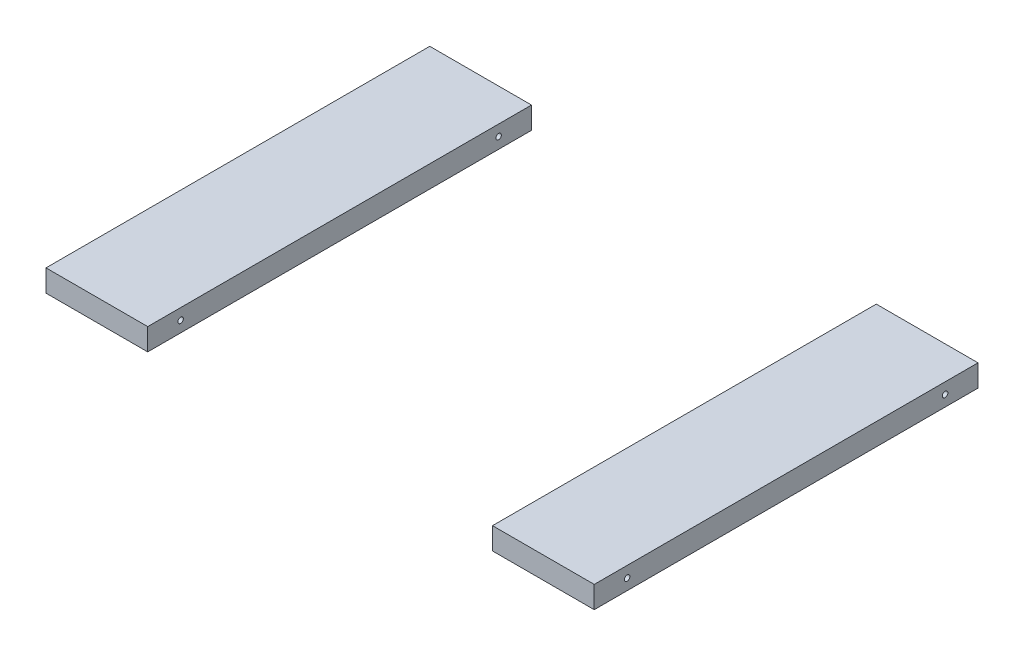
ISO-10303-21;
HEADER;
FILE_DESCRIPTION(('STEP AP214'),'2;1');
FILE_NAME('part.step','',(''),(''),'','','');
FILE_SCHEMA(('AUTOMOTIVE_DESIGN { 1 0 10303 214 1 1 1 1 }'));
ENDSEC;
DATA;
#1=APPLICATION_CONTEXT('core data for automotive mechanical design processes');
#2=APPLICATION_PROTOCOL_DEFINITION('international standard','automotive_design',2000,#1);
#3=PRODUCT_CONTEXT('',#1,'mechanical');
#4=PRODUCT('Part','Part','',(#3));
#5=PRODUCT_RELATED_PRODUCT_CATEGORY('part','',(#4));
#6=PRODUCT_DEFINITION_FORMATION('','',#4);
#7=PRODUCT_DEFINITION_CONTEXT('part definition',#1,'design');
#8=PRODUCT_DEFINITION('design','',#6,#7);
#9=PRODUCT_DEFINITION_SHAPE('','',#8);
#10=(LENGTH_UNIT() NAMED_UNIT(*) SI_UNIT(.MILLI.,.METRE.));
#11=(NAMED_UNIT(*) PLANE_ANGLE_UNIT() SI_UNIT($,.RADIAN.));
#12=(NAMED_UNIT(*) SI_UNIT($,.STERADIAN.) SOLID_ANGLE_UNIT());
#13=UNCERTAINTY_MEASURE_WITH_UNIT(LENGTH_MEASURE(1.E-05),#10,'distance_accuracy_value','');
#14=(GEOMETRIC_REPRESENTATION_CONTEXT(3) GLOBAL_UNCERTAINTY_ASSIGNED_CONTEXT((#13)) GLOBAL_UNIT_ASSIGNED_CONTEXT((#10,
#11,#12)) REPRESENTATION_CONTEXT('',''));
#15=CARTESIAN_POINT('',(0.,0.,0.));
#16=DIRECTION('',(0.,0.,1.));
#17=DIRECTION('',(1.,0.,0.));
#18=AXIS2_PLACEMENT_3D('',#15,#16,#17);
#19=CARTESIAN_POINT('',(-250.,20.,-175.));
#20=DIRECTION('',(0.,0.,1.));
#21=DIRECTION('',(1.,0.,0.));
#22=AXIS2_PLACEMENT_3D('',#19,#20,#21);
#23=PLANE('',#22);
#24=DIRECTION('',(-1.,0.,0.));
#25=VECTOR('',#24,1.);
#26=CARTESIAN_POINT('',(-250.,0.,-175.));
#27=LINE('',#26,#25);
#28=CARTESIAN_POINT('',(250.,0.,-175.));
#29=VERTEX_POINT('',#28);
#30=CARTESIAN_POINT('',(157.224048573218,0.,-175.));
#31=VERTEX_POINT('',#30);
#32=EDGE_CURVE('E76',#29,#31,#27,.T.);
#33=ORIENTED_EDGE('',*,*,#32,.T.);
#34=DIRECTION('',(0.,1.,0.));
#35=VECTOR('',#34,1.);
#36=CARTESIAN_POINT('',(157.224048573218,0.,-175.));
#37=LINE('',#36,#35);
#38=CARTESIAN_POINT('',(157.224048573218,20.,-175.));
#39=VERTEX_POINT('',#38);
#40=EDGE_CURVE('E95',#31,#39,#37,.T.);
#41=ORIENTED_EDGE('',*,*,#40,.T.);
#42=DIRECTION('',(-1.,0.,0.));
#43=VECTOR('',#42,1.);
#44=CARTESIAN_POINT('',(-250.,20.,-175.));
#45=LINE('',#44,#43);
#46=CARTESIAN_POINT('',(250.,20.,-175.));
#47=VERTEX_POINT('',#46);
#48=EDGE_CURVE('E90',#47,#39,#45,.T.);
#49=ORIENTED_EDGE('',*,*,#48,.F.);
#50=DIRECTION('',(0.,-1.,0.));
#51=VECTOR('',#50,1.);
#52=CARTESIAN_POINT('',(250.,20.,-175.));
#53=LINE('',#52,#51);
#54=EDGE_CURVE('E93',#47,#29,#53,.T.);
#55=ORIENTED_EDGE('',*,*,#54,.T.);
#56=EDGE_LOOP('',(#33,#41,#49,#55));
#57=FACE_BOUND('',#56,.T.);
#58=ADVANCED_FACE('F43',(#57),#23,.F.);
#59=CARTESIAN_POINT('',(-250.,20.,175.));
#60=DIRECTION('',(0.,0.,-1.));
#61=DIRECTION('',(-1.,0.,0.));
#62=AXIS2_PLACEMENT_3D('',#59,#60,#61);
#63=PLANE('',#62);
#64=DIRECTION('',(1.,0.,0.));
#65=VECTOR('',#64,1.);
#66=CARTESIAN_POINT('',(-250.,20.,175.));
#67=LINE('',#66,#65);
#68=CARTESIAN_POINT('',(157.224048573218,20.,175.));
#69=VERTEX_POINT('',#68);
#70=CARTESIAN_POINT('',(250.,20.,175.));
#71=VERTEX_POINT('',#70);
#72=EDGE_CURVE('E103',#69,#71,#67,.T.);
#73=ORIENTED_EDGE('',*,*,#72,.F.);
#74=DIRECTION('',(0.,1.,0.));
#75=VECTOR('',#74,1.);
#76=CARTESIAN_POINT('',(157.224048573218,0.,175.));
#77=LINE('',#76,#75);
#78=CARTESIAN_POINT('',(157.224048573218,0.,175.));
#79=VERTEX_POINT('',#78);
#80=EDGE_CURVE('E12',#79,#69,#77,.T.);
#81=ORIENTED_EDGE('',*,*,#80,.F.);
#82=DIRECTION('',(1.,0.,0.));
#83=VECTOR('',#82,1.);
#84=CARTESIAN_POINT('',(-250.,0.,175.));
#85=LINE('',#84,#83);
#86=CARTESIAN_POINT('',(250.,0.,175.));
#87=VERTEX_POINT('',#86);
#88=EDGE_CURVE('E85',#79,#87,#85,.T.);
#89=ORIENTED_EDGE('',*,*,#88,.T.);
#90=DIRECTION('',(0.,-1.,0.));
#91=VECTOR('',#90,1.);
#92=CARTESIAN_POINT('',(250.,20.,175.));
#93=LINE('',#92,#91);
#94=EDGE_CURVE('E115',#71,#87,#93,.T.);
#95=ORIENTED_EDGE('',*,*,#94,.F.);
#96=EDGE_LOOP('',(#73,#81,#89,#95));
#97=FACE_BOUND('',#96,.T.);
#98=ADVANCED_FACE('F151',(#97),#63,.F.);
#99=CARTESIAN_POINT('',(0.,20.,0.));
#100=DIRECTION('',(0.,1.,0.));
#101=DIRECTION('',(0.,0.,1.));
#102=AXIS2_PLACEMENT_3D('',#99,#100,#101);
#103=PLANE('',#102);
#104=DIRECTION('',(0.,0.,-1.));
#105=VECTOR('',#104,1.);
#106=CARTESIAN_POINT('',(157.224048573218,20.,-175.));
#107=LINE('',#106,#105);
#108=EDGE_CURVE('E52',#69,#39,#107,.T.);
#109=ORIENTED_EDGE('',*,*,#108,.F.);
#110=ORIENTED_EDGE('',*,*,#72,.T.);
#111=DIRECTION('',(0.,0.,-1.));
#112=VECTOR('',#111,1.);
#113=CARTESIAN_POINT('',(250.,20.,-175.));
#114=LINE('',#113,#112);
#115=EDGE_CURVE('E98',#71,#47,#114,.T.);
#116=ORIENTED_EDGE('',*,*,#115,.T.);
#117=ORIENTED_EDGE('',*,*,#48,.T.);
#118=EDGE_LOOP('',(#109,#110,#116,#117));
#119=FACE_BOUND('',#118,.T.);
#120=ADVANCED_FACE('F101',(#119),#103,.T.);
#121=CARTESIAN_POINT('',(0.,0.,0.));
#122=DIRECTION('',(0.,1.,0.));
#123=DIRECTION('',(0.,0.,1.));
#124=AXIS2_PLACEMENT_3D('',#121,#122,#123);
#125=PLANE('',#124);
#126=ORIENTED_EDGE('',*,*,#88,.F.);
#127=DIRECTION('',(0.,0.,-1.));
#128=VECTOR('',#127,1.);
#129=CARTESIAN_POINT('',(157.224048573218,0.,-175.));
#130=LINE('',#129,#128);
#131=EDGE_CURVE('E97',#79,#31,#130,.T.);
#132=ORIENTED_EDGE('',*,*,#131,.T.);
#133=ORIENTED_EDGE('',*,*,#32,.F.);
#134=DIRECTION('',(0.,0.,-1.));
#135=VECTOR('',#134,1.);
#136=CARTESIAN_POINT('',(250.,0.,-175.));
#137=LINE('',#136,#135);
#138=EDGE_CURVE('E107',#87,#29,#137,.T.);
#139=ORIENTED_EDGE('',*,*,#138,.F.);
#140=EDGE_LOOP('',(#126,#132,#133,#139));
#141=FACE_BOUND('',#140,.T.);
#142=ADVANCED_FACE('F138',(#141),#125,.F.);
#143=CARTESIAN_POINT('',(250.,20.,-175.));
#144=DIRECTION('',(-1.,0.,0.));
#145=DIRECTION('',(0.,0.,1.));
#146=AXIS2_PLACEMENT_3D('',#143,#144,#145);
#147=PLANE('',#146);
#148=CARTESIAN_POINT('',(250.,10.,145.));
#149=DIRECTION('',(1.,0.,0.));
#150=DIRECTION('',(0.,0.,-1.));
#151=AXIS2_PLACEMENT_3D('',#148,#149,#150);
#152=CIRCLE('',#151,2.5);
#153=CARTESIAN_POINT('',(250.,10.,142.5));
#154=VERTEX_POINT('',#153);
#155=EDGE_CURVE('E123',#154,#154,#152,.T.);
#156=ORIENTED_EDGE('',*,*,#155,.F.);
#157=EDGE_LOOP('',(#156));
#158=FACE_BOUND('',#157,.T.);
#159=CARTESIAN_POINT('',(250.,10.,-145.));
#160=DIRECTION('',(1.,0.,0.));
#161=DIRECTION('',(0.,0.,-1.));
#162=AXIS2_PLACEMENT_3D('',#159,#160,#161);
#163=CIRCLE('',#162,2.5);
#164=CARTESIAN_POINT('',(250.,10.,-147.5));
#165=VERTEX_POINT('',#164);
#166=EDGE_CURVE('E113',#165,#165,#163,.T.);
#167=ORIENTED_EDGE('',*,*,#166,.F.);
#168=EDGE_LOOP('',(#167));
#169=FACE_BOUND('',#168,.T.);
#170=ORIENTED_EDGE('',*,*,#138,.T.);
#171=ORIENTED_EDGE('',*,*,#54,.F.);
#172=ORIENTED_EDGE('',*,*,#115,.F.);
#173=ORIENTED_EDGE('',*,*,#94,.T.);
#174=EDGE_LOOP('',(#170,#171,#172,#173));
#175=FACE_BOUND('',#174,.T.);
#176=ADVANCED_FACE('F106',(#158,#169,#175),#147,.F.);
#177=CARTESIAN_POINT('',(157.224048573218,0.,-175.));
#178=DIRECTION('',(1.,0.,0.));
#179=DIRECTION('',(0.,0.,-1.));
#180=AXIS2_PLACEMENT_3D('',#177,#178,#179);
#181=PLANE('',#180);
#182=CARTESIAN_POINT('',(157.224048573218,10.,145.));
#183=DIRECTION('',(1.,0.,0.));
#184=DIRECTION('',(0.,0.,-1.));
#185=AXIS2_PLACEMENT_3D('',#182,#183,#184);
#186=CIRCLE('',#185,2.5);
#187=CARTESIAN_POINT('',(157.224048573218,10.,142.5));
#188=VERTEX_POINT('',#187);
#189=EDGE_CURVE('E46',#188,#188,#186,.T.);
#190=ORIENTED_EDGE('',*,*,#189,.T.);
#191=EDGE_LOOP('',(#190));
#192=FACE_BOUND('',#191,.T.);
#193=CARTESIAN_POINT('',(157.224048573218,10.,-145.));
#194=DIRECTION('',(1.,0.,0.));
#195=DIRECTION('',(0.,0.,-1.));
#196=AXIS2_PLACEMENT_3D('',#193,#194,#195);
#197=CIRCLE('',#196,2.5);
#198=CARTESIAN_POINT('',(157.224048573218,10.,-147.5));
#199=VERTEX_POINT('',#198);
#200=EDGE_CURVE('E121',#199,#199,#197,.T.);
#201=ORIENTED_EDGE('',*,*,#200,.T.);
#202=EDGE_LOOP('',(#201));
#203=FACE_BOUND('',#202,.T.);
#204=ORIENTED_EDGE('',*,*,#108,.T.);
#205=ORIENTED_EDGE('',*,*,#40,.F.);
#206=ORIENTED_EDGE('',*,*,#131,.F.);
#207=ORIENTED_EDGE('',*,*,#80,.T.);
#208=EDGE_LOOP('',(#204,#205,#206,#207));
#209=FACE_BOUND('',#208,.T.);
#210=ADVANCED_FACE('F137',(#192,#203,#209),#181,.F.);
#211=CARTESIAN_POINT('',(-250.,10.,-145.));
#212=DIRECTION('',(1.,0.,0.));
#213=DIRECTION('',(0.,0.,-1.));
#214=AXIS2_PLACEMENT_3D('',#211,#212,#213);
#215=CYLINDRICAL_SURFACE('',#214,2.5);
#216=ORIENTED_EDGE('',*,*,#166,.T.);
#217=EDGE_LOOP('',(#216));
#218=FACE_BOUND('',#217,.T.);
#219=ORIENTED_EDGE('',*,*,#200,.F.);
#220=EDGE_LOOP('',(#219));
#221=FACE_BOUND('',#220,.T.);
#222=ADVANCED_FACE('F133',(#218,#221),#215,.F.);
#223=CARTESIAN_POINT('',(-250.,10.,145.));
#224=DIRECTION('',(1.,0.,0.));
#225=DIRECTION('',(0.,0.,-1.));
#226=AXIS2_PLACEMENT_3D('',#223,#224,#225);
#227=CYLINDRICAL_SURFACE('',#226,2.5);
#228=ORIENTED_EDGE('',*,*,#155,.T.);
#229=EDGE_LOOP('',(#228));
#230=FACE_BOUND('',#229,.T.);
#231=ORIENTED_EDGE('',*,*,#189,.F.);
#232=EDGE_LOOP('',(#231));
#233=FACE_BOUND('',#232,.T.);
#234=ADVANCED_FACE('F184',(#230,#233),#227,.F.);
#235=CLOSED_SHELL('',(#58,#98,#120,#142,#176,#210,#222,#234));
#236=MANIFOLD_SOLID_BREP('B2',#235);
#237=CARTESIAN_POINT('',(-250.,20.,-175.));
#238=DIRECTION('',(1.,0.,0.));
#239=DIRECTION('',(0.,0.,-1.));
#240=AXIS2_PLACEMENT_3D('',#237,#238,#239);
#241=PLANE('',#240);
#242=CARTESIAN_POINT('',(-250.,10.,145.));
#243=DIRECTION('',(1.,0.,0.));
#244=DIRECTION('',(0.,0.,-1.));
#245=AXIS2_PLACEMENT_3D('',#242,#243,#244);
#246=CIRCLE('',#245,2.5);
#247=CARTESIAN_POINT('',(-250.,10.,142.5));
#248=VERTEX_POINT('',#247);
#249=EDGE_CURVE('E270',#248,#248,#246,.T.);
#250=ORIENTED_EDGE('',*,*,#249,.T.);
#251=EDGE_LOOP('',(#250));
#252=FACE_BOUND('',#251,.T.);
#253=CARTESIAN_POINT('',(-250.,10.,-145.));
#254=DIRECTION('',(1.,0.,0.));
#255=DIRECTION('',(0.,0.,-1.));
#256=AXIS2_PLACEMENT_3D('',#253,#254,#255);
#257=CIRCLE('',#256,2.5);
#258=CARTESIAN_POINT('',(-250.,10.,-147.5));
#259=VERTEX_POINT('',#258);
#260=EDGE_CURVE('E276',#259,#259,#257,.T.);
#261=ORIENTED_EDGE('',*,*,#260,.T.);
#262=EDGE_LOOP('',(#261));
#263=FACE_BOUND('',#262,.T.);
#264=DIRECTION('',(0.,0.,1.));
#265=VECTOR('',#264,1.);
#266=CARTESIAN_POINT('',(-250.,0.,-175.));
#267=LINE('',#266,#265);
#268=CARTESIAN_POINT('',(-250.,0.,-175.));
#269=VERTEX_POINT('',#268);
#270=CARTESIAN_POINT('',(-250.,0.,175.));
#271=VERTEX_POINT('',#270);
#272=EDGE_CURVE('E247',#269,#271,#267,.T.);
#273=ORIENTED_EDGE('',*,*,#272,.T.);
#274=DIRECTION('',(0.,-1.,0.));
#275=VECTOR('',#274,1.);
#276=CARTESIAN_POINT('',(-250.,20.,175.));
#277=LINE('',#276,#275);
#278=CARTESIAN_POINT('',(-250.,20.,175.));
#279=VERTEX_POINT('',#278);
#280=EDGE_CURVE('E218',#279,#271,#277,.T.);
#281=ORIENTED_EDGE('',*,*,#280,.F.);
#282=DIRECTION('',(0.,0.,1.));
#283=VECTOR('',#282,1.);
#284=CARTESIAN_POINT('',(-250.,20.,-175.));
#285=LINE('',#284,#283);
#286=CARTESIAN_POINT('',(-250.,20.,-175.));
#287=VERTEX_POINT('',#286);
#288=EDGE_CURVE('E235',#287,#279,#285,.T.);
#289=ORIENTED_EDGE('',*,*,#288,.F.);
#290=DIRECTION('',(0.,-1.,0.));
#291=VECTOR('',#290,1.);
#292=CARTESIAN_POINT('',(-250.,20.,-175.));
#293=LINE('',#292,#291);
#294=EDGE_CURVE('E41',#287,#269,#293,.T.);
#295=ORIENTED_EDGE('',*,*,#294,.T.);
#296=EDGE_LOOP('',(#273,#281,#289,#295));
#297=FACE_BOUND('',#296,.T.);
#298=ADVANCED_FACE('F209',(#252,#263,#297),#241,.F.);
#299=CARTESIAN_POINT('',(0.,20.,0.));
#300=DIRECTION('',(0.,1.,0.));
#301=DIRECTION('',(0.,0.,1.));
#302=AXIS2_PLACEMENT_3D('',#299,#300,#301);
#303=PLANE('',#302);
#304=DIRECTION('',(0.,0.,1.));
#305=VECTOR('',#304,1.);
#306=CARTESIAN_POINT('',(-157.224048573218,20.,-175.));
#307=LINE('',#306,#305);
#308=CARTESIAN_POINT('',(-157.224048573218,20.,-175.));
#309=VERTEX_POINT('',#308);
#310=CARTESIAN_POINT('',(-157.224048573218,20.,175.));
#311=VERTEX_POINT('',#310);
#312=EDGE_CURVE('E274',#309,#311,#307,.T.);
#313=ORIENTED_EDGE('',*,*,#312,.F.);
#314=DIRECTION('',(-1.,0.,0.));
#315=VECTOR('',#314,1.);
#316=CARTESIAN_POINT('',(-250.,20.,-175.));
#317=LINE('',#316,#315);
#318=EDGE_CURVE('E264',#309,#287,#317,.T.);
#319=ORIENTED_EDGE('',*,*,#318,.T.);
#320=ORIENTED_EDGE('',*,*,#288,.T.);
#321=DIRECTION('',(1.,0.,0.));
#322=VECTOR('',#321,1.);
#323=CARTESIAN_POINT('',(-250.,20.,175.));
#324=LINE('',#323,#322);
#325=EDGE_CURVE('E260',#279,#311,#324,.T.);
#326=ORIENTED_EDGE('',*,*,#325,.T.);
#327=EDGE_LOOP('',(#313,#319,#320,#326));
#328=FACE_BOUND('',#327,.T.);
#329=ADVANCED_FACE('F299',(#328),#303,.T.);
#330=CARTESIAN_POINT('',(0.,0.,0.));
#331=DIRECTION('',(0.,1.,0.));
#332=DIRECTION('',(0.,0.,1.));
#333=AXIS2_PLACEMENT_3D('',#330,#331,#332);
#334=PLANE('',#333);
#335=DIRECTION('',(-1.,0.,0.));
#336=VECTOR('',#335,1.);
#337=CARTESIAN_POINT('',(-250.,0.,-175.));
#338=LINE('',#337,#336);
#339=CARTESIAN_POINT('',(-157.224048573218,0.,-175.));
#340=VERTEX_POINT('',#339);
#341=EDGE_CURVE('E255',#340,#269,#338,.T.);
#342=ORIENTED_EDGE('',*,*,#341,.F.);
#343=DIRECTION('',(0.,0.,1.));
#344=VECTOR('',#343,1.);
#345=CARTESIAN_POINT('',(-157.224048573218,0.,-175.));
#346=LINE('',#345,#344);
#347=CARTESIAN_POINT('',(-157.224048573218,0.,175.));
#348=VERTEX_POINT('',#347);
#349=EDGE_CURVE('E263',#340,#348,#346,.T.);
#350=ORIENTED_EDGE('',*,*,#349,.T.);
#351=DIRECTION('',(1.,0.,0.));
#352=VECTOR('',#351,1.);
#353=CARTESIAN_POINT('',(-250.,0.,175.));
#354=LINE('',#353,#352);
#355=EDGE_CURVE('E254',#271,#348,#354,.T.);
#356=ORIENTED_EDGE('',*,*,#355,.F.);
#357=ORIENTED_EDGE('',*,*,#272,.F.);
#358=EDGE_LOOP('',(#342,#350,#356,#357));
#359=FACE_BOUND('',#358,.T.);
#360=ADVANCED_FACE('F262',(#359),#334,.F.);
#361=CARTESIAN_POINT('',(-250.,20.,175.));
#362=DIRECTION('',(0.,0.,-1.));
#363=DIRECTION('',(-1.,0.,0.));
#364=AXIS2_PLACEMENT_3D('',#361,#362,#363);
#365=PLANE('',#364);
#366=ORIENTED_EDGE('',*,*,#355,.T.);
#367=DIRECTION('',(0.,1.,0.));
#368=VECTOR('',#367,1.);
#369=CARTESIAN_POINT('',(-157.224048573218,0.,175.));
#370=LINE('',#369,#368);
#371=EDGE_CURVE('E226',#348,#311,#370,.T.);
#372=ORIENTED_EDGE('',*,*,#371,.T.);
#373=ORIENTED_EDGE('',*,*,#325,.F.);
#374=ORIENTED_EDGE('',*,*,#280,.T.);
#375=EDGE_LOOP('',(#366,#372,#373,#374));
#376=FACE_BOUND('',#375,.T.);
#377=ADVANCED_FACE('F259',(#376),#365,.F.);
#378=CARTESIAN_POINT('',(-250.,20.,-175.));
#379=DIRECTION('',(0.,0.,1.));
#380=DIRECTION('',(1.,0.,0.));
#381=AXIS2_PLACEMENT_3D('',#378,#379,#380);
#382=PLANE('',#381);
#383=ORIENTED_EDGE('',*,*,#318,.F.);
#384=DIRECTION('',(0.,1.,0.));
#385=VECTOR('',#384,1.);
#386=CARTESIAN_POINT('',(-157.224048573218,0.,-175.));
#387=LINE('',#386,#385);
#388=EDGE_CURVE('E284',#340,#309,#387,.T.);
#389=ORIENTED_EDGE('',*,*,#388,.F.);
#390=ORIENTED_EDGE('',*,*,#341,.T.);
#391=ORIENTED_EDGE('',*,*,#294,.F.);
#392=EDGE_LOOP('',(#383,#389,#390,#391));
#393=FACE_BOUND('',#392,.T.);
#394=ADVANCED_FACE('F211',(#393),#382,.F.);
#395=CARTESIAN_POINT('',(-157.224048573218,0.,-175.));
#396=DIRECTION('',(-1.,0.,0.));
#397=DIRECTION('',(0.,0.,1.));
#398=AXIS2_PLACEMENT_3D('',#395,#396,#397);
#399=PLANE('',#398);
#400=CARTESIAN_POINT('',(-157.224048573218,10.,145.));
#401=DIRECTION('',(-1.,0.,0.));
#402=DIRECTION('',(0.,0.,1.));
#403=AXIS2_PLACEMENT_3D('',#400,#401,#402);
#404=CIRCLE('',#403,2.5);
#405=CARTESIAN_POINT('',(-157.224048573218,10.,147.5));
#406=VERTEX_POINT('',#405);
#407=EDGE_CURVE('E213',#406,#406,#404,.T.);
#408=ORIENTED_EDGE('',*,*,#407,.T.);
#409=EDGE_LOOP('',(#408));
#410=FACE_BOUND('',#409,.T.);
#411=CARTESIAN_POINT('',(-157.224048573218,10.,-145.));
#412=DIRECTION('',(-1.,0.,0.));
#413=DIRECTION('',(0.,0.,1.));
#414=AXIS2_PLACEMENT_3D('',#411,#412,#413);
#415=CIRCLE('',#414,2.5);
#416=CARTESIAN_POINT('',(-157.224048573218,10.,-142.5));
#417=VERTEX_POINT('',#416);
#418=EDGE_CURVE('E268',#417,#417,#415,.T.);
#419=ORIENTED_EDGE('',*,*,#418,.T.);
#420=EDGE_LOOP('',(#419));
#421=FACE_BOUND('',#420,.T.);
#422=ORIENTED_EDGE('',*,*,#312,.T.);
#423=ORIENTED_EDGE('',*,*,#371,.F.);
#424=ORIENTED_EDGE('',*,*,#349,.F.);
#425=ORIENTED_EDGE('',*,*,#388,.T.);
#426=EDGE_LOOP('',(#422,#423,#424,#425));
#427=FACE_BOUND('',#426,.T.);
#428=ADVANCED_FACE('F298',(#410,#421,#427),#399,.F.);
#429=CARTESIAN_POINT('',(-250.,10.,-145.));
#430=DIRECTION('',(1.,0.,0.));
#431=DIRECTION('',(0.,0.,-1.));
#432=AXIS2_PLACEMENT_3D('',#429,#430,#431);
#433=CYLINDRICAL_SURFACE('',#432,2.5);
#434=ORIENTED_EDGE('',*,*,#260,.F.);
#435=EDGE_LOOP('',(#434));
#436=FACE_BOUND('',#435,.T.);
#437=ORIENTED_EDGE('',*,*,#418,.F.);
#438=EDGE_LOOP('',(#437));
#439=FACE_BOUND('',#438,.T.);
#440=ADVANCED_FACE('F317',(#436,#439),#433,.F.);
#441=CARTESIAN_POINT('',(-250.,10.,145.));
#442=DIRECTION('',(1.,0.,0.));
#443=DIRECTION('',(0.,0.,-1.));
#444=AXIS2_PLACEMENT_3D('',#441,#442,#443);
#445=CYLINDRICAL_SURFACE('',#444,2.5);
#446=ORIENTED_EDGE('',*,*,#249,.F.);
#447=EDGE_LOOP('',(#446));
#448=FACE_BOUND('',#447,.T.);
#449=ORIENTED_EDGE('',*,*,#407,.F.);
#450=EDGE_LOOP('',(#449));
#451=FACE_BOUND('',#450,.T.);
#452=ADVANCED_FACE('F323',(#448,#451),#445,.F.);
#453=CLOSED_SHELL('',(#298,#329,#360,#377,#394,#428,#440,#452));
#454=MANIFOLD_SOLID_BREP('B6',#453);
#455=ADVANCED_BREP_SHAPE_REPRESENTATION('',(#18,#236,#454),#14);
#456=SHAPE_DEFINITION_REPRESENTATION(#9,#455);
ENDSEC;
END-ISO-10303-21;
